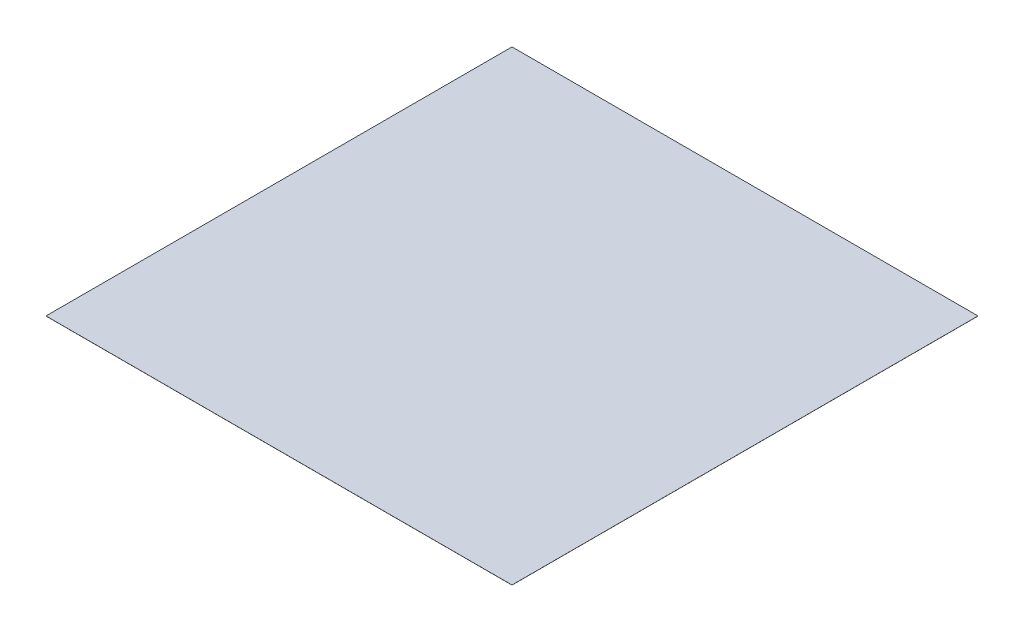
ISO-10303-21;
HEADER;
FILE_DESCRIPTION(('STEP AP214'),'2;1');
FILE_NAME('part.step','',(''),(''),'','','');
FILE_SCHEMA(('AUTOMOTIVE_DESIGN { 1 0 10303 214 1 1 1 1 }'));
ENDSEC;
DATA;
#1=APPLICATION_CONTEXT('core data for automotive mechanical design processes');
#2=APPLICATION_PROTOCOL_DEFINITION('international standard','automotive_design',2000,#1);
#3=PRODUCT_CONTEXT('',#1,'mechanical');
#4=PRODUCT('Part','Part','',(#3));
#5=PRODUCT_RELATED_PRODUCT_CATEGORY('part','',(#4));
#6=PRODUCT_DEFINITION_FORMATION('','',#4);
#7=PRODUCT_DEFINITION_CONTEXT('part definition',#1,'design');
#8=PRODUCT_DEFINITION('design','',#6,#7);
#9=PRODUCT_DEFINITION_SHAPE('','',#8);
#10=(LENGTH_UNIT() NAMED_UNIT(*) SI_UNIT(.MILLI.,.METRE.));
#11=(NAMED_UNIT(*) PLANE_ANGLE_UNIT() SI_UNIT($,.RADIAN.));
#12=(NAMED_UNIT(*) SI_UNIT($,.STERADIAN.) SOLID_ANGLE_UNIT());
#13=UNCERTAINTY_MEASURE_WITH_UNIT(LENGTH_MEASURE(1.E-05),#10,'distance_accuracy_value','');
#14=(GEOMETRIC_REPRESENTATION_CONTEXT(3) GLOBAL_UNCERTAINTY_ASSIGNED_CONTEXT((#13)) GLOBAL_UNIT_ASSIGNED_CONTEXT((#10,
#11,#12)) REPRESENTATION_CONTEXT('',''));
#15=CARTESIAN_POINT('',(0.,0.,0.));
#16=DIRECTION('',(0.,0.,1.));
#17=DIRECTION('',(1.,0.,0.));
#18=AXIS2_PLACEMENT_3D('',#15,#16,#17);
#19=CARTESIAN_POINT('',(500.,0.2,500.));
#20=DIRECTION('',(-1.,0.,0.));
#21=DIRECTION('',(0.,0.,1.));
#22=AXIS2_PLACEMENT_3D('',#19,#20,#21);
#23=PLANE('',#22);
#24=DIRECTION('',(0.,0.,-1.));
#25=VECTOR('',#24,1.);
#26=CARTESIAN_POINT('',(500.,0.,500.));
#27=LINE('',#26,#25);
#28=CARTESIAN_POINT('',(500.,0.,500.));
#29=VERTEX_POINT('',#28);
#30=CARTESIAN_POINT('',(500.,0.,-500.));
#31=VERTEX_POINT('',#30);
#32=EDGE_CURVE('E104',#29,#31,#27,.T.);
#33=ORIENTED_EDGE('',*,*,#32,.T.);
#34=DIRECTION('',(0.,-1.,0.));
#35=VECTOR('',#34,1.);
#36=CARTESIAN_POINT('',(500.,0.2,-500.));
#37=LINE('',#36,#35);
#38=CARTESIAN_POINT('',(500.,0.2,-500.));
#39=VERTEX_POINT('',#38);
#40=EDGE_CURVE('E11',#39,#31,#37,.T.);
#41=ORIENTED_EDGE('',*,*,#40,.F.);
#42=DIRECTION('',(0.,0.,-1.));
#43=VECTOR('',#42,1.);
#44=CARTESIAN_POINT('',(500.,0.2,500.));
#45=LINE('',#44,#43);
#46=CARTESIAN_POINT('',(500.,0.2,500.));
#47=VERTEX_POINT('',#46);
#48=EDGE_CURVE('E92',#47,#39,#45,.T.);
#49=ORIENTED_EDGE('',*,*,#48,.F.);
#50=DIRECTION('',(0.,-1.,0.));
#51=VECTOR('',#50,1.);
#52=CARTESIAN_POINT('',(500.,0.2,500.));
#53=LINE('',#52,#51);
#54=EDGE_CURVE('E100',#47,#29,#53,.T.);
#55=ORIENTED_EDGE('',*,*,#54,.T.);
#56=EDGE_LOOP('',(#33,#41,#49,#55));
#57=FACE_BOUND('',#56,.T.);
#58=ADVANCED_FACE('F41',(#57),#23,.F.);
#59=CARTESIAN_POINT('',(-500.,0.2,-500.));
#60=DIRECTION('',(0.,0.,1.));
#61=DIRECTION('',(1.,0.,0.));
#62=AXIS2_PLACEMENT_3D('',#59,#60,#61);
#63=PLANE('',#62);
#64=DIRECTION('',(-1.,0.,0.));
#65=VECTOR('',#64,1.);
#66=CARTESIAN_POINT('',(-500.,0.,-500.));
#67=LINE('',#66,#65);
#68=CARTESIAN_POINT('',(-500.,0.,-500.));
#69=VERTEX_POINT('',#68);
#70=EDGE_CURVE('E96',#31,#69,#67,.T.);
#71=ORIENTED_EDGE('',*,*,#70,.T.);
#72=DIRECTION('',(0.,-1.,0.));
#73=VECTOR('',#72,1.);
#74=CARTESIAN_POINT('',(-500.,0.2,-500.));
#75=LINE('',#74,#73);
#76=CARTESIAN_POINT('',(-500.,0.2,-500.));
#77=VERTEX_POINT('',#76);
#78=EDGE_CURVE('E49',#77,#69,#75,.T.);
#79=ORIENTED_EDGE('',*,*,#78,.F.);
#80=DIRECTION('',(-1.,0.,0.));
#81=VECTOR('',#80,1.);
#82=CARTESIAN_POINT('',(-500.,0.2,-500.));
#83=LINE('',#82,#81);
#84=EDGE_CURVE('E87',#39,#77,#83,.T.);
#85=ORIENTED_EDGE('',*,*,#84,.F.);
#86=ORIENTED_EDGE('',*,*,#40,.T.);
#87=EDGE_LOOP('',(#71,#79,#85,#86));
#88=FACE_BOUND('',#87,.T.);
#89=ADVANCED_FACE('F95',(#88),#63,.F.);
#90=CARTESIAN_POINT('',(-500.,0.2,500.));
#91=DIRECTION('',(1.,0.,0.));
#92=DIRECTION('',(0.,0.,-1.));
#93=AXIS2_PLACEMENT_3D('',#90,#91,#92);
#94=PLANE('',#93);
#95=DIRECTION('',(0.,0.,1.));
#96=VECTOR('',#95,1.);
#97=CARTESIAN_POINT('',(-500.,0.,500.));
#98=LINE('',#97,#96);
#99=CARTESIAN_POINT('',(-500.,0.,500.));
#100=VERTEX_POINT('',#99);
#101=EDGE_CURVE('E74',#69,#100,#98,.T.);
#102=ORIENTED_EDGE('',*,*,#101,.T.);
#103=DIRECTION('',(0.,-1.,0.));
#104=VECTOR('',#103,1.);
#105=CARTESIAN_POINT('',(-500.,0.2,500.));
#106=LINE('',#105,#104);
#107=CARTESIAN_POINT('',(-500.,0.2,500.));
#108=VERTEX_POINT('',#107);
#109=EDGE_CURVE('E97',#108,#100,#106,.T.);
#110=ORIENTED_EDGE('',*,*,#109,.F.);
#111=DIRECTION('',(0.,0.,1.));
#112=VECTOR('',#111,1.);
#113=CARTESIAN_POINT('',(-500.,0.2,500.));
#114=LINE('',#113,#112);
#115=EDGE_CURVE('E90',#77,#108,#114,.T.);
#116=ORIENTED_EDGE('',*,*,#115,.F.);
#117=ORIENTED_EDGE('',*,*,#78,.T.);
#118=EDGE_LOOP('',(#102,#110,#116,#117));
#119=FACE_BOUND('',#118,.T.);
#120=ADVANCED_FACE('F98',(#119),#94,.F.);
#121=CARTESIAN_POINT('',(-500.,0.2,500.));
#122=DIRECTION('',(0.,0.,-1.));
#123=DIRECTION('',(-1.,0.,0.));
#124=AXIS2_PLACEMENT_3D('',#121,#122,#123);
#125=PLANE('',#124);
#126=DIRECTION('',(1.,0.,0.));
#127=VECTOR('',#126,1.);
#128=CARTESIAN_POINT('',(-500.,0.,500.));
#129=LINE('',#128,#127);
#130=EDGE_CURVE('E80',#100,#29,#129,.T.);
#131=ORIENTED_EDGE('',*,*,#130,.T.);
#132=ORIENTED_EDGE('',*,*,#54,.F.);
#133=DIRECTION('',(1.,0.,0.));
#134=VECTOR('',#133,1.);
#135=CARTESIAN_POINT('',(-500.,0.2,500.));
#136=LINE('',#135,#134);
#137=EDGE_CURVE('E57',#108,#47,#136,.T.);
#138=ORIENTED_EDGE('',*,*,#137,.F.);
#139=ORIENTED_EDGE('',*,*,#109,.T.);
#140=EDGE_LOOP('',(#131,#132,#138,#139));
#141=FACE_BOUND('',#140,.T.);
#142=ADVANCED_FACE('F111',(#141),#125,.F.);
#143=CARTESIAN_POINT('',(0.,0.2,0.));
#144=DIRECTION('',(0.,-1.,0.));
#145=DIRECTION('',(0.,0.,-1.));
#146=AXIS2_PLACEMENT_3D('',#143,#144,#145);
#147=PLANE('',#146);
#148=ORIENTED_EDGE('',*,*,#48,.T.);
#149=ORIENTED_EDGE('',*,*,#84,.T.);
#150=ORIENTED_EDGE('',*,*,#115,.T.);
#151=ORIENTED_EDGE('',*,*,#137,.T.);
#152=EDGE_LOOP('',(#148,#149,#150,#151));
#153=FACE_BOUND('',#152,.T.);
#154=ADVANCED_FACE('F88',(#153),#147,.F.);
#155=CARTESIAN_POINT('',(0.,0.,0.));
#156=DIRECTION('',(0.,-1.,0.));
#157=DIRECTION('',(0.,0.,-1.));
#158=AXIS2_PLACEMENT_3D('',#155,#156,#157);
#159=PLANE('',#158);
#160=ORIENTED_EDGE('',*,*,#32,.F.);
#161=ORIENTED_EDGE('',*,*,#130,.F.);
#162=ORIENTED_EDGE('',*,*,#101,.F.);
#163=ORIENTED_EDGE('',*,*,#70,.F.);
#164=EDGE_LOOP('',(#160,#161,#162,#163));
#165=FACE_BOUND('',#164,.T.);
#166=ADVANCED_FACE('F114',(#165),#159,.T.);
#167=CLOSED_SHELL('',(#58,#89,#120,#142,#154,#166));
#168=MANIFOLD_SOLID_BREP('B2',#167);
#169=ADVANCED_BREP_SHAPE_REPRESENTATION('',(#18,#168),#14);
#170=SHAPE_DEFINITION_REPRESENTATION(#9,#169);
ENDSEC;
END-ISO-10303-21;
